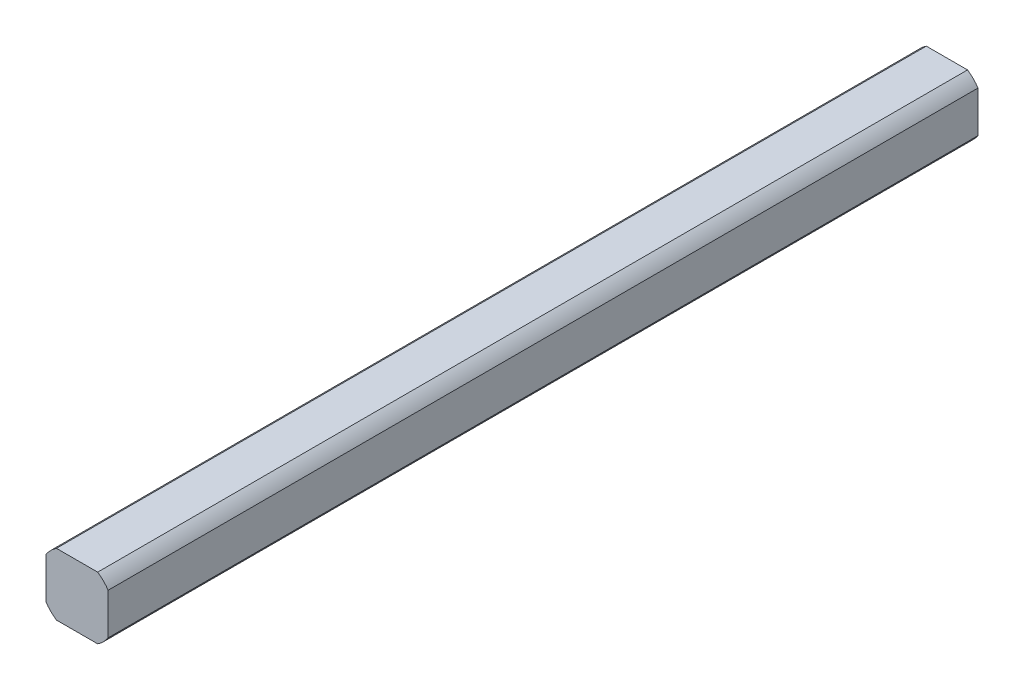
ISO-10303-21;
HEADER;
FILE_DESCRIPTION(('STEP AP214'),'2;1');
FILE_NAME('part.step','',(''),(''),'','','');
FILE_SCHEMA(('AUTOMOTIVE_DESIGN { 1 0 10303 214 1 1 1 1 }'));
ENDSEC;
DATA;
#1=APPLICATION_CONTEXT('core data for automotive mechanical design processes');
#2=APPLICATION_PROTOCOL_DEFINITION('international standard','automotive_design',2000,#1);
#3=PRODUCT_CONTEXT('',#1,'mechanical');
#4=PRODUCT('Part','Part','',(#3));
#5=PRODUCT_RELATED_PRODUCT_CATEGORY('part','',(#4));
#6=PRODUCT_DEFINITION_FORMATION('','',#4);
#7=PRODUCT_DEFINITION_CONTEXT('part definition',#1,'design');
#8=PRODUCT_DEFINITION('design','',#6,#7);
#9=PRODUCT_DEFINITION_SHAPE('','',#8);
#10=(LENGTH_UNIT() NAMED_UNIT(*) SI_UNIT(.MILLI.,.METRE.));
#11=(NAMED_UNIT(*) PLANE_ANGLE_UNIT() SI_UNIT($,.RADIAN.));
#12=(NAMED_UNIT(*) SI_UNIT($,.STERADIAN.) SOLID_ANGLE_UNIT());
#13=UNCERTAINTY_MEASURE_WITH_UNIT(LENGTH_MEASURE(1.E-05),#10,'distance_accuracy_value','');
#14=(GEOMETRIC_REPRESENTATION_CONTEXT(3) GLOBAL_UNCERTAINTY_ASSIGNED_CONTEXT((#13)) GLOBAL_UNIT_ASSIGNED_CONTEXT((#10,
#11,#12)) REPRESENTATION_CONTEXT('',''));
#15=CARTESIAN_POINT('',(0.,0.,0.));
#16=DIRECTION('',(0.,0.,1.));
#17=DIRECTION('',(1.,0.,0.));
#18=AXIS2_PLACEMENT_3D('',#15,#16,#17);
#19=CARTESIAN_POINT('',(3.175,-3.175,-54.3915036709849));
#20=DIRECTION('',(0.,0.,1.));
#21=DIRECTION('',(0.,-1.,0.));
#22=AXIS2_PLACEMENT_3D('',#19,#20,#21);
#23=PLANE('',#22);
#24=CARTESIAN_POINT('',(0.,0.,-54.3915036709849));
#25=DIRECTION('',(0.,0.,1.));
#26=DIRECTION('',(1.,0.,0.));
#27=AXIS2_PLACEMENT_3D('',#24,#25,#26);
#28=CIRCLE('',#27,3.81);
#29=CARTESIAN_POINT('',(2.10605674187568,-3.175,-54.3915036709849));
#30=VERTEX_POINT('',#29);
#31=CARTESIAN_POINT('',(3.175,-2.10605674187568,-54.3915036709849));
#32=VERTEX_POINT('',#31);
#33=EDGE_CURVE('E59',#30,#32,#28,.T.);
#34=ORIENTED_EDGE('',*,*,#33,.F.);
#35=DIRECTION('',(-1.,0.,0.));
#36=VECTOR('',#35,1.);
#37=CARTESIAN_POINT('',(3.175,-3.175,-54.3915036709849));
#38=LINE('',#37,#36);
#39=CARTESIAN_POINT('',(-2.10605674187568,-3.175,-54.3915036709849));
#40=VERTEX_POINT('',#39);
#41=EDGE_CURVE('E122',#30,#40,#38,.T.);
#42=ORIENTED_EDGE('',*,*,#41,.T.);
#43=CARTESIAN_POINT('',(-3.175,-2.10605674187568,-54.3915036709849));
#44=VERTEX_POINT('',#43);
#45=EDGE_CURVE('E149',#44,#40,#28,.T.);
#46=ORIENTED_EDGE('',*,*,#45,.F.);
#47=DIRECTION('',(0.,1.,0.));
#48=VECTOR('',#47,1.);
#49=CARTESIAN_POINT('',(-3.175,-3.175,-54.3915036709849));
#50=LINE('',#49,#48);
#51=CARTESIAN_POINT('',(-3.175,2.10605674187568,-54.3915036709849));
#52=VERTEX_POINT('',#51);
#53=EDGE_CURVE('E125',#44,#52,#50,.T.);
#54=ORIENTED_EDGE('',*,*,#53,.T.);
#55=CARTESIAN_POINT('',(-2.10605674187568,3.175,-54.3915036709849));
#56=VERTEX_POINT('',#55);
#57=EDGE_CURVE('E116',#56,#52,#28,.T.);
#58=ORIENTED_EDGE('',*,*,#57,.F.);
#59=DIRECTION('',(-1.,0.,0.));
#60=VECTOR('',#59,1.);
#61=CARTESIAN_POINT('',(3.175,3.175,-54.3915036709849));
#62=LINE('',#61,#60);
#63=CARTESIAN_POINT('',(2.10605674187568,3.175,-54.3915036709849));
#64=VERTEX_POINT('',#63);
#65=EDGE_CURVE('E115',#64,#56,#62,.T.);
#66=ORIENTED_EDGE('',*,*,#65,.F.);
#67=CARTESIAN_POINT('',(3.175,2.10605674187568,-54.3915036709849));
#68=VERTEX_POINT('',#67);
#69=EDGE_CURVE('E101',#68,#64,#28,.T.);
#70=ORIENTED_EDGE('',*,*,#69,.F.);
#71=DIRECTION('',(0.,1.,0.));
#72=VECTOR('',#71,1.);
#73=CARTESIAN_POINT('',(3.175,-3.175,-54.3915036709849));
#74=LINE('',#73,#72);
#75=EDGE_CURVE('E112',#32,#68,#74,.T.);
#76=ORIENTED_EDGE('',*,*,#75,.F.);
#77=EDGE_LOOP('',(#34,#42,#46,#54,#58,#66,#70,#76));
#78=FACE_BOUND('',#77,.T.);
#79=ADVANCED_FACE('F37',(#78),#23,.F.);
#80=CARTESIAN_POINT('',(3.175,3.175,34.5084963290151));
#81=DIRECTION('',(0.,-1.,0.));
#82=DIRECTION('',(0.,0.,-1.));
#83=AXIS2_PLACEMENT_3D('',#80,#81,#82);
#84=PLANE('',#83);
#85=DIRECTION('',(0.,0.,1.));
#86=VECTOR('',#85,1.);
#87=CARTESIAN_POINT('',(2.10605674187568,3.175,-54.3915036709849));
#88=LINE('',#87,#86);
#89=CARTESIAN_POINT('',(2.10605674187568,3.175,34.5084963290151));
#90=VERTEX_POINT('',#89);
#91=EDGE_CURVE('E128',#64,#90,#88,.T.);
#92=ORIENTED_EDGE('',*,*,#91,.F.);
#93=ORIENTED_EDGE('',*,*,#65,.T.);
#94=DIRECTION('',(0.,0.,1.));
#95=VECTOR('',#94,1.);
#96=CARTESIAN_POINT('',(-2.10605674187568,3.175,-54.3915036709849));
#97=LINE('',#96,#95);
#98=CARTESIAN_POINT('',(-2.10605674187568,3.175,34.5084963290151));
#99=VERTEX_POINT('',#98);
#100=EDGE_CURVE('E161',#99,#56,#97,.F.);
#101=ORIENTED_EDGE('',*,*,#100,.F.);
#102=DIRECTION('',(-1.,0.,0.));
#103=VECTOR('',#102,1.);
#104=CARTESIAN_POINT('',(3.175,3.175,34.5084963290151));
#105=LINE('',#104,#103);
#106=EDGE_CURVE('E138',#90,#99,#105,.T.);
#107=ORIENTED_EDGE('',*,*,#106,.F.);
#108=EDGE_LOOP('',(#92,#93,#101,#107));
#109=FACE_BOUND('',#108,.T.);
#110=ADVANCED_FACE('F168',(#109),#84,.F.);
#111=CARTESIAN_POINT('',(3.175,-3.175,34.5084963290151));
#112=DIRECTION('',(0.,0.,-1.));
#113=DIRECTION('',(0.,1.,0.));
#114=AXIS2_PLACEMENT_3D('',#111,#112,#113);
#115=PLANE('',#114);
#116=CARTESIAN_POINT('',(0.,0.,34.5084963290151));
#117=DIRECTION('',(0.,0.,1.));
#118=DIRECTION('',(1.,0.,0.));
#119=AXIS2_PLACEMENT_3D('',#116,#117,#118);
#120=CIRCLE('',#119,3.81);
#121=CARTESIAN_POINT('',(3.175,2.10605674187568,34.5084963290151));
#122=VERTEX_POINT('',#121);
#123=EDGE_CURVE('E51',#122,#90,#120,.T.);
#124=ORIENTED_EDGE('',*,*,#123,.T.);
#125=ORIENTED_EDGE('',*,*,#106,.T.);
#126=CARTESIAN_POINT('',(-3.175,2.10605674187568,34.5084963290151));
#127=VERTEX_POINT('',#126);
#128=EDGE_CURVE('E154',#99,#127,#120,.T.);
#129=ORIENTED_EDGE('',*,*,#128,.T.);
#130=DIRECTION('',(0.,-1.,0.));
#131=VECTOR('',#130,1.);
#132=CARTESIAN_POINT('',(-3.175,-3.175,34.5084963290151));
#133=LINE('',#132,#131);
#134=CARTESIAN_POINT('',(-3.175,-2.10605674187568,34.5084963290151));
#135=VERTEX_POINT('',#134);
#136=EDGE_CURVE('E120',#127,#135,#133,.T.);
#137=ORIENTED_EDGE('',*,*,#136,.T.);
#138=CARTESIAN_POINT('',(-2.10605674187568,-3.175,34.5084963290151));
#139=VERTEX_POINT('',#138);
#140=EDGE_CURVE('E270',#135,#139,#120,.T.);
#141=ORIENTED_EDGE('',*,*,#140,.T.);
#142=DIRECTION('',(-1.,0.,0.));
#143=VECTOR('',#142,1.);
#144=CARTESIAN_POINT('',(3.175,-3.175,34.5084963290151));
#145=LINE('',#144,#143);
#146=CARTESIAN_POINT('',(2.10605674187568,-3.175,34.5084963290151));
#147=VERTEX_POINT('',#146);
#148=EDGE_CURVE('E135',#147,#139,#145,.T.);
#149=ORIENTED_EDGE('',*,*,#148,.F.);
#150=CARTESIAN_POINT('',(3.175,-2.10605674187568,34.5084963290151));
#151=VERTEX_POINT('',#150);
#152=EDGE_CURVE('E155',#147,#151,#120,.T.);
#153=ORIENTED_EDGE('',*,*,#152,.T.);
#154=DIRECTION('',(0.,-1.,0.));
#155=VECTOR('',#154,1.);
#156=CARTESIAN_POINT('',(3.175,-3.175,34.5084963290151));
#157=LINE('',#156,#155);
#158=EDGE_CURVE('E119',#122,#151,#157,.T.);
#159=ORIENTED_EDGE('',*,*,#158,.F.);
#160=EDGE_LOOP('',(#124,#125,#129,#137,#141,#149,#153,#159));
#161=FACE_BOUND('',#160,.T.);
#162=ADVANCED_FACE('F166',(#161),#115,.F.);
#163=CARTESIAN_POINT('',(3.175,-3.175,34.5084963290151));
#164=DIRECTION('',(0.,1.,0.));
#165=DIRECTION('',(0.,0.,1.));
#166=AXIS2_PLACEMENT_3D('',#163,#164,#165);
#167=PLANE('',#166);
#168=DIRECTION('',(0.,0.,1.));
#169=VECTOR('',#168,1.);
#170=CARTESIAN_POINT('',(-2.10605674187568,-3.175,-54.3915036709849));
#171=LINE('',#170,#169);
#172=EDGE_CURVE('E160',#40,#139,#171,.T.);
#173=ORIENTED_EDGE('',*,*,#172,.F.);
#174=ORIENTED_EDGE('',*,*,#41,.F.);
#175=DIRECTION('',(0.,0.,1.));
#176=VECTOR('',#175,1.);
#177=CARTESIAN_POINT('',(2.10605674187568,-3.175,-54.3915036709849));
#178=LINE('',#177,#176);
#179=EDGE_CURVE('E158',#147,#30,#178,.F.);
#180=ORIENTED_EDGE('',*,*,#179,.F.);
#181=ORIENTED_EDGE('',*,*,#148,.T.);
#182=EDGE_LOOP('',(#173,#174,#180,#181));
#183=FACE_BOUND('',#182,.T.);
#184=ADVANCED_FACE('F174',(#183),#167,.F.);
#185=CARTESIAN_POINT('',(3.175,0.,0.));
#186=DIRECTION('',(-1.,0.,0.));
#187=DIRECTION('',(0.,0.,1.));
#188=AXIS2_PLACEMENT_3D('',#185,#186,#187);
#189=PLANE('',#188);
#190=DIRECTION('',(0.,0.,1.));
#191=VECTOR('',#190,1.);
#192=CARTESIAN_POINT('',(3.175,-2.10605674187568,-54.3915036709849));
#193=LINE('',#192,#191);
#194=EDGE_CURVE('E107',#32,#151,#193,.T.);
#195=ORIENTED_EDGE('',*,*,#194,.F.);
#196=ORIENTED_EDGE('',*,*,#75,.T.);
#197=DIRECTION('',(0.,0.,1.));
#198=VECTOR('',#197,1.);
#199=CARTESIAN_POINT('',(3.175,2.10605674187568,-54.3915036709849));
#200=LINE('',#199,#198);
#201=EDGE_CURVE('E98',#122,#68,#200,.F.);
#202=ORIENTED_EDGE('',*,*,#201,.F.);
#203=ORIENTED_EDGE('',*,*,#158,.T.);
#204=EDGE_LOOP('',(#195,#196,#202,#203));
#205=FACE_BOUND('',#204,.T.);
#206=ADVANCED_FACE('F118',(#205),#189,.F.);
#207=CARTESIAN_POINT('',(-3.175,0.,0.));
#208=DIRECTION('',(-1.,0.,0.));
#209=DIRECTION('',(0.,0.,1.));
#210=AXIS2_PLACEMENT_3D('',#207,#208,#209);
#211=PLANE('',#210);
#212=ORIENTED_EDGE('',*,*,#53,.F.);
#213=DIRECTION('',(0.,0.,1.));
#214=VECTOR('',#213,1.);
#215=CARTESIAN_POINT('',(-3.175,-2.10605674187568,-54.3915036709849));
#216=LINE('',#215,#214);
#217=EDGE_CURVE('E12',#44,#135,#216,.T.);
#218=ORIENTED_EDGE('',*,*,#217,.T.);
#219=ORIENTED_EDGE('',*,*,#136,.F.);
#220=DIRECTION('',(0.,0.,1.));
#221=VECTOR('',#220,1.);
#222=CARTESIAN_POINT('',(-3.175,2.10605674187568,-54.3915036709849));
#223=LINE('',#222,#221);
#224=EDGE_CURVE('E44',#127,#52,#223,.F.);
#225=ORIENTED_EDGE('',*,*,#224,.T.);
#226=EDGE_LOOP('',(#212,#218,#219,#225));
#227=FACE_BOUND('',#226,.T.);
#228=ADVANCED_FACE('F145',(#227),#211,.T.);
#229=CARTESIAN_POINT('',(0.,0.,-54.3915036709849));
#230=DIRECTION('',(0.,0.,1.));
#231=DIRECTION('',(1.,0.,0.));
#232=AXIS2_PLACEMENT_3D('',#229,#230,#231);
#233=CYLINDRICAL_SURFACE('',#232,3.81);
#234=ORIENTED_EDGE('',*,*,#100,.T.);
#235=ORIENTED_EDGE('',*,*,#57,.T.);
#236=ORIENTED_EDGE('',*,*,#224,.F.);
#237=ORIENTED_EDGE('',*,*,#128,.F.);
#238=EDGE_LOOP('',(#234,#235,#236,#237));
#239=FACE_BOUND('',#238,.T.);
#240=ADVANCED_FACE('F182',(#239),#233,.T.);
#241=ORIENTED_EDGE('',*,*,#172,.T.);
#242=ORIENTED_EDGE('',*,*,#140,.F.);
#243=ORIENTED_EDGE('',*,*,#217,.F.);
#244=ORIENTED_EDGE('',*,*,#45,.T.);
#245=EDGE_LOOP('',(#241,#242,#243,#244));
#246=FACE_BOUND('',#245,.T.);
#247=ADVANCED_FACE('F187',(#246),#233,.T.);
#248=ORIENTED_EDGE('',*,*,#91,.T.);
#249=ORIENTED_EDGE('',*,*,#123,.F.);
#250=ORIENTED_EDGE('',*,*,#201,.T.);
#251=ORIENTED_EDGE('',*,*,#69,.T.);
#252=EDGE_LOOP('',(#248,#249,#250,#251));
#253=FACE_BOUND('',#252,.T.);
#254=ADVANCED_FACE('F100',(#253),#233,.T.);
#255=ORIENTED_EDGE('',*,*,#179,.T.);
#256=ORIENTED_EDGE('',*,*,#33,.T.);
#257=ORIENTED_EDGE('',*,*,#194,.T.);
#258=ORIENTED_EDGE('',*,*,#152,.F.);
#259=EDGE_LOOP('',(#255,#256,#257,#258));
#260=FACE_BOUND('',#259,.T.);
#261=ADVANCED_FACE('F186',(#260),#233,.T.);
#262=CLOSED_SHELL('',(#79,#110,#162,#184,#206,#228,#240,#247,#254,#261));
#263=MANIFOLD_SOLID_BREP('B2',#262);
#264=ADVANCED_BREP_SHAPE_REPRESENTATION('',(#18,#263),#14);
#265=SHAPE_DEFINITION_REPRESENTATION(#9,#264);
ENDSEC;
END-ISO-10303-21;
